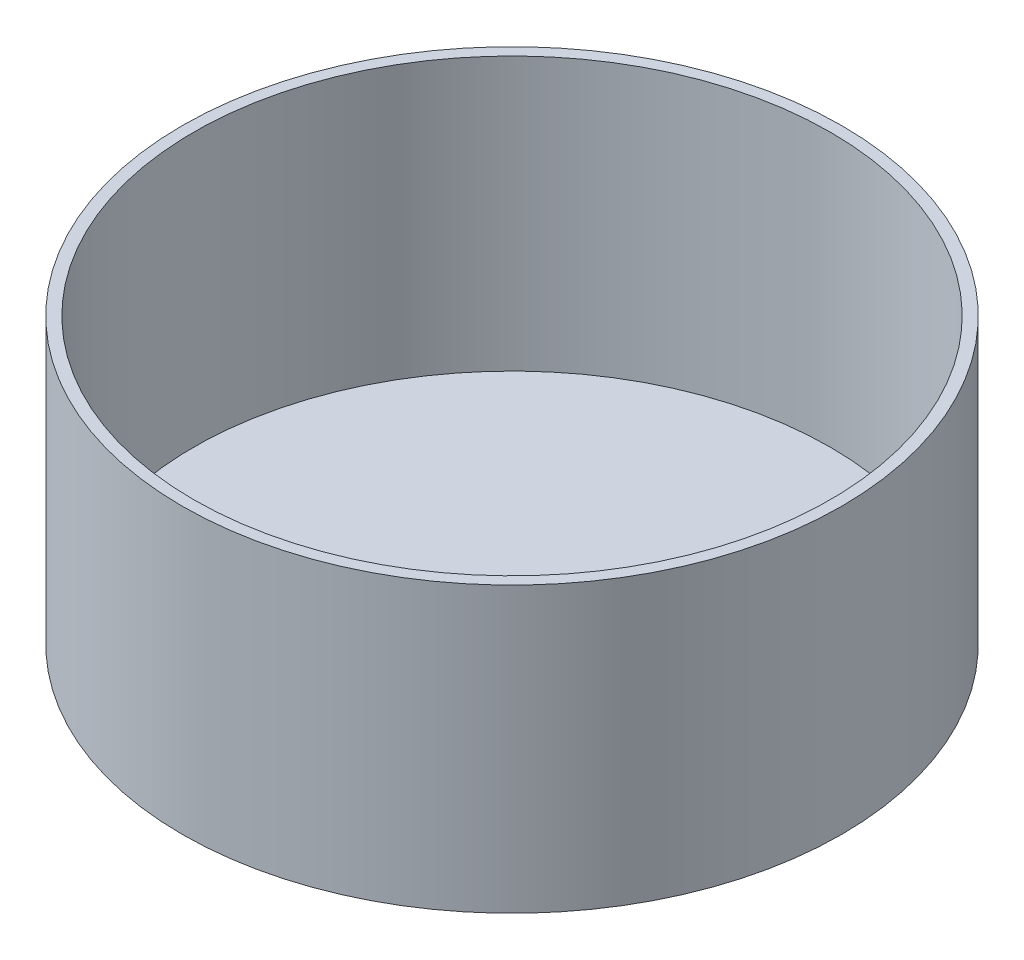
ISO-10303-21;
HEADER;
FILE_DESCRIPTION(('STEP AP214'),'2;1');
FILE_NAME('part.step','',(''),(''),'','','');
FILE_SCHEMA(('AUTOMOTIVE_DESIGN { 1 0 10303 214 1 1 1 1 }'));
ENDSEC;
DATA;
#1=APPLICATION_CONTEXT('core data for automotive mechanical design processes');
#2=APPLICATION_PROTOCOL_DEFINITION('international standard','automotive_design',2000,#1);
#3=PRODUCT_CONTEXT('',#1,'mechanical');
#4=PRODUCT('Part','Part','',(#3));
#5=PRODUCT_RELATED_PRODUCT_CATEGORY('part','',(#4));
#6=PRODUCT_DEFINITION_FORMATION('','',#4);
#7=PRODUCT_DEFINITION_CONTEXT('part definition',#1,'design');
#8=PRODUCT_DEFINITION('design','',#6,#7);
#9=PRODUCT_DEFINITION_SHAPE('','',#8);
#10=(LENGTH_UNIT() NAMED_UNIT(*) SI_UNIT(.MILLI.,.METRE.));
#11=(NAMED_UNIT(*) PLANE_ANGLE_UNIT() SI_UNIT($,.RADIAN.));
#12=(NAMED_UNIT(*) SI_UNIT($,.STERADIAN.) SOLID_ANGLE_UNIT());
#13=UNCERTAINTY_MEASURE_WITH_UNIT(LENGTH_MEASURE(1.E-05),#10,'distance_accuracy_value','');
#14=(GEOMETRIC_REPRESENTATION_CONTEXT(3) GLOBAL_UNCERTAINTY_ASSIGNED_CONTEXT((#13)) GLOBAL_UNIT_ASSIGNED_CONTEXT((#10,
#11,#12)) REPRESENTATION_CONTEXT('',''));
#15=CARTESIAN_POINT('',(0.,0.,0.));
#16=DIRECTION('',(0.,0.,1.));
#17=DIRECTION('',(1.,0.,0.));
#18=AXIS2_PLACEMENT_3D('',#15,#16,#17);
#19=CARTESIAN_POINT('',(0.,50.,0.));
#20=DIRECTION('',(0.,-1.,0.));
#21=DIRECTION('',(0.,0.,-1.));
#22=AXIS2_PLACEMENT_3D('',#19,#20,#21);
#23=CYLINDRICAL_SURFACE('',#22,58.);
#24=CARTESIAN_POINT('',(0.,50.,0.));
#25=DIRECTION('',(0.,1.,0.));
#26=DIRECTION('',(0.,0.,1.));
#27=AXIS2_PLACEMENT_3D('',#24,#25,#26);
#28=CIRCLE('',#27,58.);
#29=CARTESIAN_POINT('',(0.,50.,58.));
#30=VERTEX_POINT('',#29);
#31=EDGE_CURVE('E10',#30,#30,#28,.T.);
#32=ORIENTED_EDGE('',*,*,#31,.F.);
#33=EDGE_LOOP('',(#32));
#34=FACE_BOUND('',#33,.T.);
#35=CARTESIAN_POINT('',(0.,0.,0.));
#36=DIRECTION('',(0.,1.,0.));
#37=DIRECTION('',(0.,0.,1.));
#38=AXIS2_PLACEMENT_3D('',#35,#36,#37);
#39=CIRCLE('',#38,58.);
#40=CARTESIAN_POINT('',(0.,0.,58.));
#41=VERTEX_POINT('',#40);
#42=EDGE_CURVE('E37',#41,#41,#39,.T.);
#43=ORIENTED_EDGE('',*,*,#42,.T.);
#44=EDGE_LOOP('',(#43));
#45=FACE_BOUND('',#44,.T.);
#46=ADVANCED_FACE('F34',(#34,#45),#23,.T.);
#47=CARTESIAN_POINT('',(0.,50.,0.));
#48=DIRECTION('',(0.,1.,0.));
#49=DIRECTION('',(0.,0.,1.));
#50=AXIS2_PLACEMENT_3D('',#47,#48,#49);
#51=PLANE('',#50);
#52=CARTESIAN_POINT('',(0.,50.,0.));
#53=DIRECTION('',(0.,1.,0.));
#54=DIRECTION('',(0.,0.,1.));
#55=AXIS2_PLACEMENT_3D('',#52,#53,#54);
#56=CIRCLE('',#55,56.);
#57=CARTESIAN_POINT('',(0.,50.,56.));
#58=VERTEX_POINT('',#57);
#59=EDGE_CURVE('E46',#58,#58,#56,.T.);
#60=ORIENTED_EDGE('',*,*,#59,.F.);
#61=EDGE_LOOP('',(#60));
#62=FACE_BOUND('',#61,.T.);
#63=ORIENTED_EDGE('',*,*,#31,.T.);
#64=EDGE_LOOP('',(#63));
#65=FACE_BOUND('',#64,.T.);
#66=ADVANCED_FACE('F61',(#62,#65),#51,.T.);
#67=CARTESIAN_POINT('',(0.,0.,0.));
#68=DIRECTION('',(0.,1.,0.));
#69=DIRECTION('',(0.,0.,1.));
#70=AXIS2_PLACEMENT_3D('',#67,#68,#69);
#71=PLANE('',#70);
#72=ORIENTED_EDGE('',*,*,#42,.F.);
#73=EDGE_LOOP('',(#72));
#74=FACE_BOUND('',#73,.T.);
#75=ADVANCED_FACE('F57',(#74),#71,.F.);
#76=CARTESIAN_POINT('',(0.,2.,0.));
#77=DIRECTION('',(0.,1.,0.));
#78=DIRECTION('',(0.,0.,1.));
#79=AXIS2_PLACEMENT_3D('',#76,#77,#78);
#80=CYLINDRICAL_SURFACE('',#79,56.);
#81=CARTESIAN_POINT('',(0.,2.,0.));
#82=DIRECTION('',(0.,1.,0.));
#83=DIRECTION('',(0.,0.,1.));
#84=AXIS2_PLACEMENT_3D('',#81,#82,#83);
#85=CIRCLE('',#84,56.);
#86=CARTESIAN_POINT('',(0.,2.,56.));
#87=VERTEX_POINT('',#86);
#88=EDGE_CURVE('E44',#87,#87,#85,.T.);
#89=ORIENTED_EDGE('',*,*,#88,.F.);
#90=EDGE_LOOP('',(#89));
#91=FACE_BOUND('',#90,.T.);
#92=ORIENTED_EDGE('',*,*,#59,.T.);
#93=EDGE_LOOP('',(#92));
#94=FACE_BOUND('',#93,.T.);
#95=ADVANCED_FACE('F54',(#91,#94),#80,.F.);
#96=CARTESIAN_POINT('',(0.,2.,0.));
#97=DIRECTION('',(0.,1.,0.));
#98=DIRECTION('',(0.,0.,1.));
#99=AXIS2_PLACEMENT_3D('',#96,#97,#98);
#100=PLANE('',#99);
#101=ORIENTED_EDGE('',*,*,#88,.T.);
#102=EDGE_LOOP('',(#101));
#103=FACE_BOUND('',#102,.T.);
#104=ADVANCED_FACE('F52',(#103),#100,.T.);
#105=CLOSED_SHELL('',(#46,#66,#75,#95,#104));
#106=MANIFOLD_SOLID_BREP('B2',#105);
#107=ADVANCED_BREP_SHAPE_REPRESENTATION('',(#18,#106),#14);
#108=SHAPE_DEFINITION_REPRESENTATION(#9,#107);
ENDSEC;
END-ISO-10303-21;
